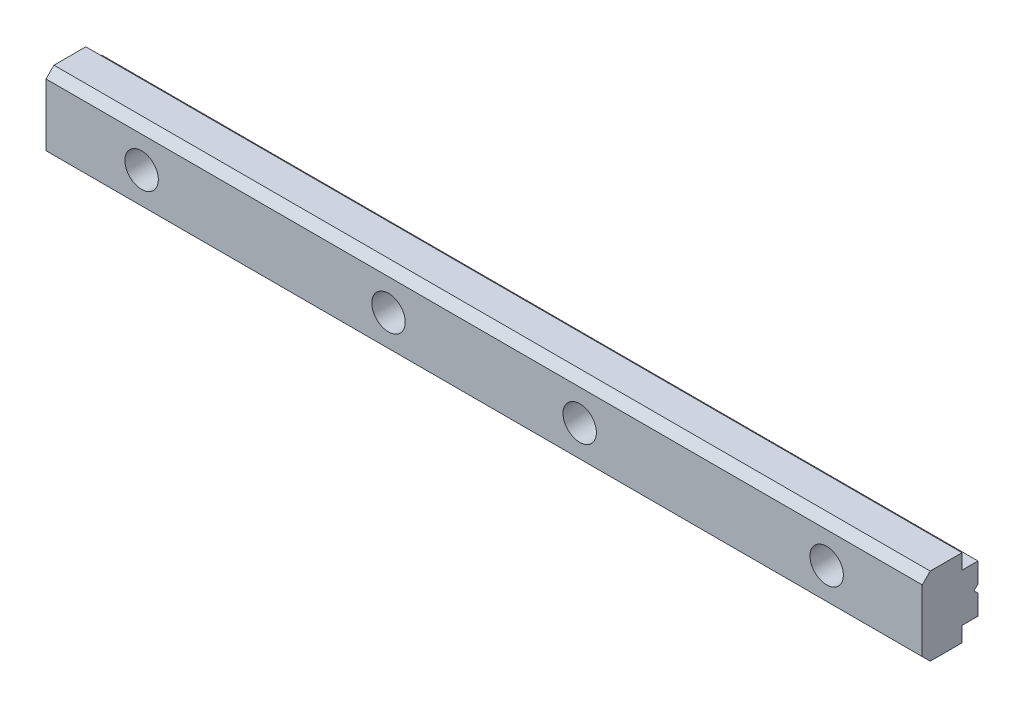
ISO-10303-21;
HEADER;
FILE_DESCRIPTION(('STEP AP214'),'2;1');
FILE_NAME('part.step','',(''),(''),'','','');
FILE_SCHEMA(('AUTOMOTIVE_DESIGN { 1 0 10303 214 1 1 1 1 }'));
ENDSEC;
DATA;
#1=APPLICATION_CONTEXT('core data for automotive mechanical design processes');
#2=APPLICATION_PROTOCOL_DEFINITION('international standard','automotive_design',2000,#1);
#3=PRODUCT_CONTEXT('',#1,'mechanical');
#4=PRODUCT('Part','Part','',(#3));
#5=PRODUCT_RELATED_PRODUCT_CATEGORY('part','',(#4));
#6=PRODUCT_DEFINITION_FORMATION('','',#4);
#7=PRODUCT_DEFINITION_CONTEXT('part definition',#1,'design');
#8=PRODUCT_DEFINITION('design','',#6,#7);
#9=PRODUCT_DEFINITION_SHAPE('','',#8);
#10=(LENGTH_UNIT() NAMED_UNIT(*) SI_UNIT(.MILLI.,.METRE.));
#11=(NAMED_UNIT(*) PLANE_ANGLE_UNIT() SI_UNIT($,.RADIAN.));
#12=(NAMED_UNIT(*) SI_UNIT($,.STERADIAN.) SOLID_ANGLE_UNIT());
#13=UNCERTAINTY_MEASURE_WITH_UNIT(LENGTH_MEASURE(1.E-05),#10,'distance_accuracy_value','');
#14=(GEOMETRIC_REPRESENTATION_CONTEXT(3) GLOBAL_UNCERTAINTY_ASSIGNED_CONTEXT((#13)) GLOBAL_UNIT_ASSIGNED_CONTEXT((#10,
#11,#12)) REPRESENTATION_CONTEXT('',''));
#15=CARTESIAN_POINT('',(0.,0.,0.));
#16=DIRECTION('',(0.,0.,1.));
#17=DIRECTION('',(1.,0.,0.));
#18=AXIS2_PLACEMENT_3D('',#15,#16,#17);
#19=CARTESIAN_POINT('',(55.,3.,0.5));
#20=DIRECTION('',(0.,-0.707106781186548,0.707106781186548));
#21=DIRECTION('',(0.,-0.707106781186548,-0.707106781186548));
#22=AXIS2_PLACEMENT_3D('',#19,#20,#21);
#23=PLANE('',#22);
#24=DIRECTION('',(-1.,0.,0.));
#25=VECTOR('',#24,1.);
#26=CARTESIAN_POINT('',(55.,2.5,0.));
#27=LINE('',#26,#25);
#28=CARTESIAN_POINT('',(55.,2.5,0.));
#29=VERTEX_POINT('',#28);
#30=CARTESIAN_POINT('',(45.0396078054371,2.5,0.));
#31=VERTEX_POINT('',#30);
#32=EDGE_CURVE('E242',#29,#31,#27,.T.);
#33=ORIENTED_EDGE('',*,*,#32,.T.);
#34=CARTESIAN_POINT('',(43.,3.,0.5));
#35=DIRECTION('',(0.,-0.707106781186548,0.707106781186548));
#36=DIRECTION('',(0.,-0.707106781186548,-0.707106781186548));
#37=AXIS2_PLACEMENT_3D('',#34,#35,#36);
#38=ELLIPSE('',#37,2.96984848098349,2.09999999999999);
#39=CARTESIAN_POINT('',(45.1,3.,0.5));
#40=VERTEX_POINT('',#39);
#41=EDGE_CURVE('E212',#31,#40,#38,.T.);
#42=ORIENTED_EDGE('',*,*,#41,.T.);
#43=DIRECTION('',(-1.,0.,0.));
#44=VECTOR('',#43,1.);
#45=CARTESIAN_POINT('',(55.,3.,0.5));
#46=LINE('',#45,#44);
#47=CARTESIAN_POINT('',(55.,3.,0.5));
#48=VERTEX_POINT('',#47);
#49=EDGE_CURVE('E237',#48,#40,#46,.T.);
#50=ORIENTED_EDGE('',*,*,#49,.F.);
#51=DIRECTION('',(0.,0.707106781186548,0.707106781186548));
#52=VECTOR('',#51,1.);
#53=CARTESIAN_POINT('',(55.,3.,0.5));
#54=LINE('',#53,#52);
#55=EDGE_CURVE('E309',#29,#48,#54,.T.);
#56=ORIENTED_EDGE('',*,*,#55,.F.);
#57=EDGE_LOOP('',(#33,#42,#50,#56));
#58=FACE_BOUND('',#57,.T.);
#59=ADVANCED_FACE('F37',(#58),#23,.F.);
#60=CARTESIAN_POINT('',(55.,0.,0.));
#61=DIRECTION('',(0.,0.,1.));
#62=DIRECTION('',(1.,0.,0.));
#63=AXIS2_PLACEMENT_3D('',#60,#61,#62);
#64=PLANE('',#63);
#65=CARTESIAN_POINT('',(43.,3.,0.));
#66=DIRECTION('',(0.,0.,-1.));
#67=DIRECTION('',(-1.,0.,0.));
#68=AXIS2_PLACEMENT_3D('',#65,#66,#67);
#69=CIRCLE('',#68,2.1);
#70=CARTESIAN_POINT('',(40.9603921945629,2.5,0.));
#71=VERTEX_POINT('',#70);
#72=EDGE_CURVE('E222',#31,#71,#69,.T.);
#73=ORIENTED_EDGE('',*,*,#72,.F.);
#74=ORIENTED_EDGE('',*,*,#32,.F.);
#75=DIRECTION('',(0.,1.,0.));
#76=VECTOR('',#75,1.);
#77=CARTESIAN_POINT('',(55.,0.,0.));
#78=LINE('',#77,#76);
#79=CARTESIAN_POINT('',(55.,0.,0.));
#80=VERTEX_POINT('',#79);
#81=EDGE_CURVE('E307',#80,#29,#78,.T.);
#82=ORIENTED_EDGE('',*,*,#81,.F.);
#83=DIRECTION('',(-1.,0.,0.));
#84=VECTOR('',#83,1.);
#85=CARTESIAN_POINT('',(55.,0.,0.));
#86=LINE('',#85,#84);
#87=CARTESIAN_POINT('',(-55.,0.,0.));
#88=VERTEX_POINT('',#87);
#89=EDGE_CURVE('E245',#80,#88,#86,.T.);
#90=ORIENTED_EDGE('',*,*,#89,.T.);
#91=DIRECTION('',(0.,1.,0.));
#92=VECTOR('',#91,1.);
#93=CARTESIAN_POINT('',(-55.,0.,0.));
#94=LINE('',#93,#92);
#95=CARTESIAN_POINT('',(-55.,2.5,0.));
#96=VERTEX_POINT('',#95);
#97=EDGE_CURVE('E335',#88,#96,#94,.T.);
#98=ORIENTED_EDGE('',*,*,#97,.T.);
#99=CARTESIAN_POINT('',(-45.0396078054371,2.5,0.));
#100=VERTEX_POINT('',#99);
#101=EDGE_CURVE('E240',#100,#96,#27,.T.);
#102=ORIENTED_EDGE('',*,*,#101,.F.);
#103=CARTESIAN_POINT('',(-43.,3.,0.));
#104=DIRECTION('',(0.,0.,-1.));
#105=DIRECTION('',(-1.,0.,0.));
#106=AXIS2_PLACEMENT_3D('',#103,#104,#105);
#107=CIRCLE('',#106,2.1);
#108=CARTESIAN_POINT('',(-40.9603921945629,2.5,0.));
#109=VERTEX_POINT('',#108);
#110=EDGE_CURVE('E289',#109,#100,#107,.T.);
#111=ORIENTED_EDGE('',*,*,#110,.F.);
#112=CARTESIAN_POINT('',(-14.0396078054371,2.5,0.));
#113=VERTEX_POINT('',#112);
#114=EDGE_CURVE('E479',#113,#109,#27,.T.);
#115=ORIENTED_EDGE('',*,*,#114,.F.);
#116=CARTESIAN_POINT('',(-12.,3.,0.));
#117=DIRECTION('',(0.,0.,-1.));
#118=DIRECTION('',(-1.,0.,0.));
#119=AXIS2_PLACEMENT_3D('',#116,#117,#118);
#120=CIRCLE('',#119,2.1);
#121=CARTESIAN_POINT('',(-9.96039219456289,2.5,0.));
#122=VERTEX_POINT('',#121);
#123=EDGE_CURVE('E279',#122,#113,#120,.T.);
#124=ORIENTED_EDGE('',*,*,#123,.F.);
#125=CARTESIAN_POINT('',(9.96039219456289,2.5,0.));
#126=VERTEX_POINT('',#125);
#127=EDGE_CURVE('E480',#126,#122,#27,.T.);
#128=ORIENTED_EDGE('',*,*,#127,.F.);
#129=CARTESIAN_POINT('',(12.,3.,0.));
#130=DIRECTION('',(0.,0.,-1.));
#131=DIRECTION('',(-1.,0.,0.));
#132=AXIS2_PLACEMENT_3D('',#129,#130,#131);
#133=CIRCLE('',#132,2.1);
#134=CARTESIAN_POINT('',(14.0396078054371,2.5,0.));
#135=VERTEX_POINT('',#134);
#136=EDGE_CURVE('E270',#135,#126,#133,.T.);
#137=ORIENTED_EDGE('',*,*,#136,.F.);
#138=EDGE_CURVE('E246',#71,#135,#27,.T.);
#139=ORIENTED_EDGE('',*,*,#138,.F.);
#140=EDGE_LOOP('',(#73,#74,#82,#90,#98,#102,#111,#115,#124,#128,#137,#139));
#141=FACE_BOUND('',#140,.T.);
#142=ADVANCED_FACE('F432',(#141),#64,.F.);
#143=CARTESIAN_POINT('',(55.,3.,0.5));
#144=DIRECTION('',(0.,0.707106781186548,0.707106781186548));
#145=DIRECTION('',(0.,-0.707106781186548,0.707106781186548));
#146=AXIS2_PLACEMENT_3D('',#143,#144,#145);
#147=PLANE('',#146);
#148=DIRECTION('',(-1.,0.,0.));
#149=VECTOR('',#148,1.);
#150=CARTESIAN_POINT('',(55.,3.5,0.));
#151=LINE('',#150,#149);
#152=CARTESIAN_POINT('',(40.9603921945629,3.5,0.));
#153=VERTEX_POINT('',#152);
#154=CARTESIAN_POINT('',(14.0396078054371,3.5,0.));
#155=VERTEX_POINT('',#154);
#156=EDGE_CURVE('E218',#153,#155,#151,.T.);
#157=ORIENTED_EDGE('',*,*,#156,.F.);
#158=CARTESIAN_POINT('',(43.,3.,0.5));
#159=DIRECTION('',(0.,0.707106781186548,0.707106781186548));
#160=DIRECTION('',(0.,0.707106781186548,-0.707106781186548));
#161=AXIS2_PLACEMENT_3D('',#158,#159,#160);
#162=ELLIPSE('',#161,2.96984848098349,2.09999999999999);
#163=CARTESIAN_POINT('',(40.9,3.,0.5));
#164=VERTEX_POINT('',#163);
#165=EDGE_CURVE('E205',#153,#164,#162,.T.);
#166=ORIENTED_EDGE('',*,*,#165,.T.);
#167=CARTESIAN_POINT('',(14.1,3.,0.5));
#168=VERTEX_POINT('',#167);
#169=EDGE_CURVE('E241',#164,#168,#46,.T.);
#170=ORIENTED_EDGE('',*,*,#169,.T.);
#171=CARTESIAN_POINT('',(12.,3.,0.5));
#172=DIRECTION('',(0.,0.707106781186548,0.707106781186548));
#173=DIRECTION('',(0.,0.707106781186548,-0.707106781186548));
#174=AXIS2_PLACEMENT_3D('',#171,#172,#173);
#175=ELLIPSE('',#174,2.96984848098349,2.09999999999999);
#176=EDGE_CURVE('E227',#168,#155,#175,.T.);
#177=ORIENTED_EDGE('',*,*,#176,.T.);
#178=EDGE_LOOP('',(#157,#166,#170,#177));
#179=FACE_BOUND('',#178,.T.);
#180=ADVANCED_FACE('F225',(#179),#147,.F.);
#181=ORIENTED_EDGE('',*,*,#169,.F.);
#182=EDGE_CURVE('E208',#164,#71,#38,.T.);
#183=ORIENTED_EDGE('',*,*,#182,.T.);
#184=ORIENTED_EDGE('',*,*,#138,.T.);
#185=CARTESIAN_POINT('',(12.,3.,0.5));
#186=DIRECTION('',(0.,-0.707106781186548,0.707106781186548));
#187=DIRECTION('',(0.,-0.707106781186548,-0.707106781186548));
#188=AXIS2_PLACEMENT_3D('',#185,#186,#187);
#189=ELLIPSE('',#188,2.96984848098349,2.09999999999999);
#190=EDGE_CURVE('E268',#135,#168,#189,.T.);
#191=ORIENTED_EDGE('',*,*,#190,.T.);
#192=EDGE_LOOP('',(#181,#183,#184,#191));
#193=FACE_BOUND('',#192,.T.);
#194=ADVANCED_FACE('F435',(#193),#23,.F.);
#195=CARTESIAN_POINT('',(9.96039219456289,3.5,0.));
#196=VERTEX_POINT('',#195);
#197=CARTESIAN_POINT('',(-9.96039219456289,3.5,0.));
#198=VERTEX_POINT('',#197);
#199=EDGE_CURVE('E228',#196,#198,#151,.T.);
#200=ORIENTED_EDGE('',*,*,#199,.F.);
#201=CARTESIAN_POINT('',(9.90000000000001,3.,0.5));
#202=VERTEX_POINT('',#201);
#203=EDGE_CURVE('E62',#196,#202,#175,.T.);
#204=ORIENTED_EDGE('',*,*,#203,.T.);
#205=CARTESIAN_POINT('',(-9.9,3.,0.5));
#206=VERTEX_POINT('',#205);
#207=EDGE_CURVE('E392',#202,#206,#46,.T.);
#208=ORIENTED_EDGE('',*,*,#207,.T.);
#209=CARTESIAN_POINT('',(-12.,3.,0.499999999999997));
#210=DIRECTION('',(0.,0.707106781186548,0.707106781186548));
#211=DIRECTION('',(0.,0.707106781186548,-0.707106781186548));
#212=AXIS2_PLACEMENT_3D('',#209,#210,#211);
#213=ELLIPSE('',#212,2.96984848098349,2.09999999999999);
#214=EDGE_CURVE('E261',#206,#198,#213,.T.);
#215=ORIENTED_EDGE('',*,*,#214,.T.);
#216=EDGE_LOOP('',(#200,#204,#208,#215));
#217=FACE_BOUND('',#216,.T.);
#218=ADVANCED_FACE('F443',(#217),#147,.F.);
#219=CARTESIAN_POINT('',(55.,3.5,0.));
#220=DIRECTION('',(0.,0.,1.));
#221=DIRECTION('',(1.,0.,0.));
#222=AXIS2_PLACEMENT_3D('',#219,#220,#221);
#223=PLANE('',#222);
#224=CARTESIAN_POINT('',(55.,3.5,0.));
#225=VERTEX_POINT('',#224);
#226=CARTESIAN_POINT('',(45.0396078054371,3.5,0.));
#227=VERTEX_POINT('',#226);
#228=EDGE_CURVE('E221',#225,#227,#151,.T.);
#229=ORIENTED_EDGE('',*,*,#228,.T.);
#230=EDGE_CURVE('E54',#153,#227,#69,.T.);
#231=ORIENTED_EDGE('',*,*,#230,.F.);
#232=ORIENTED_EDGE('',*,*,#156,.T.);
#233=EDGE_CURVE('E265',#196,#155,#133,.T.);
#234=ORIENTED_EDGE('',*,*,#233,.F.);
#235=ORIENTED_EDGE('',*,*,#199,.T.);
#236=CARTESIAN_POINT('',(-14.0396078054371,3.5,0.));
#237=VERTEX_POINT('',#236);
#238=EDGE_CURVE('E262',#237,#198,#120,.T.);
#239=ORIENTED_EDGE('',*,*,#238,.F.);
#240=CARTESIAN_POINT('',(-40.9603921945629,3.5,0.));
#241=VERTEX_POINT('',#240);
#242=EDGE_CURVE('E232',#237,#241,#151,.T.);
#243=ORIENTED_EDGE('',*,*,#242,.T.);
#244=CARTESIAN_POINT('',(-45.0396078054371,3.5,0.));
#245=VERTEX_POINT('',#244);
#246=EDGE_CURVE('E258',#245,#241,#107,.T.);
#247=ORIENTED_EDGE('',*,*,#246,.F.);
#248=CARTESIAN_POINT('',(-55.,3.5,0.));
#249=VERTEX_POINT('',#248);
#250=EDGE_CURVE('E231',#245,#249,#151,.T.);
#251=ORIENTED_EDGE('',*,*,#250,.T.);
#252=DIRECTION('',(0.,1.,0.));
#253=VECTOR('',#252,1.);
#254=CARTESIAN_POINT('',(-55.,3.5,0.));
#255=LINE('',#254,#253);
#256=CARTESIAN_POINT('',(-55.,6.,0.));
#257=VERTEX_POINT('',#256);
#258=EDGE_CURVE('E344',#249,#257,#255,.T.);
#259=ORIENTED_EDGE('',*,*,#258,.T.);
#260=DIRECTION('',(-1.,0.,0.));
#261=VECTOR('',#260,1.);
#262=CARTESIAN_POINT('',(55.,6.,0.));
#263=LINE('',#262,#261);
#264=CARTESIAN_POINT('',(55.,6.,0.));
#265=VERTEX_POINT('',#264);
#266=EDGE_CURVE('E235',#265,#257,#263,.T.);
#267=ORIENTED_EDGE('',*,*,#266,.F.);
#268=DIRECTION('',(0.,1.,0.));
#269=VECTOR('',#268,1.);
#270=CARTESIAN_POINT('',(55.,3.5,0.));
#271=LINE('',#270,#269);
#272=EDGE_CURVE('E313',#225,#265,#271,.T.);
#273=ORIENTED_EDGE('',*,*,#272,.F.);
#274=EDGE_LOOP('',(#229,#231,#232,#234,#235,#239,#243,#247,#251,#259,#267,#273));
#275=FACE_BOUND('',#274,.T.);
#276=ADVANCED_FACE('F217',(#275),#223,.F.);
#277=ORIENTED_EDGE('',*,*,#207,.F.);
#278=EDGE_CURVE('E276',#202,#126,#189,.T.);
#279=ORIENTED_EDGE('',*,*,#278,.T.);
#280=ORIENTED_EDGE('',*,*,#127,.T.);
#281=CARTESIAN_POINT('',(-12.,3.,0.500000000000003));
#282=DIRECTION('',(0.,-0.707106781186548,0.707106781186548));
#283=DIRECTION('',(0.,-0.707106781186548,-0.707106781186548));
#284=AXIS2_PLACEMENT_3D('',#281,#282,#283);
#285=ELLIPSE('',#284,2.96984848098349,2.09999999999999);
#286=EDGE_CURVE('E282',#122,#206,#285,.T.);
#287=ORIENTED_EDGE('',*,*,#286,.T.);
#288=EDGE_LOOP('',(#277,#279,#280,#287));
#289=FACE_BOUND('',#288,.T.);
#290=ADVANCED_FACE('F445',(#289),#23,.F.);
#291=ORIENTED_EDGE('',*,*,#242,.F.);
#292=CARTESIAN_POINT('',(-14.1,3.,0.5));
#293=VERTEX_POINT('',#292);
#294=EDGE_CURVE('E283',#237,#293,#213,.T.);
#295=ORIENTED_EDGE('',*,*,#294,.T.);
#296=CARTESIAN_POINT('',(-40.9,3.,0.5));
#297=VERTEX_POINT('',#296);
#298=EDGE_CURVE('E389',#293,#297,#46,.T.);
#299=ORIENTED_EDGE('',*,*,#298,.T.);
#300=CARTESIAN_POINT('',(-43.,3.,0.499999999999997));
#301=DIRECTION('',(0.,0.707106781186548,0.707106781186548));
#302=DIRECTION('',(0.,0.707106781186548,-0.707106781186548));
#303=AXIS2_PLACEMENT_3D('',#300,#301,#302);
#304=ELLIPSE('',#303,2.96984848098349,2.09999999999999);
#305=EDGE_CURVE('E257',#297,#241,#304,.T.);
#306=ORIENTED_EDGE('',*,*,#305,.T.);
#307=EDGE_LOOP('',(#291,#295,#299,#306));
#308=FACE_BOUND('',#307,.T.);
#309=ADVANCED_FACE('F387',(#308),#147,.F.);
#310=ORIENTED_EDGE('',*,*,#298,.F.);
#311=EDGE_CURVE('E286',#293,#113,#285,.T.);
#312=ORIENTED_EDGE('',*,*,#311,.T.);
#313=ORIENTED_EDGE('',*,*,#114,.T.);
#314=CARTESIAN_POINT('',(-43.,3.,0.500000000000003));
#315=DIRECTION('',(0.,-0.707106781186548,0.707106781186548));
#316=DIRECTION('',(0.,-0.707106781186548,-0.707106781186548));
#317=AXIS2_PLACEMENT_3D('',#314,#315,#316);
#318=ELLIPSE('',#317,2.96984848098349,2.09999999999999);
#319=EDGE_CURVE('E292',#109,#297,#318,.T.);
#320=ORIENTED_EDGE('',*,*,#319,.T.);
#321=EDGE_LOOP('',(#310,#312,#313,#320));
#322=FACE_BOUND('',#321,.T.);
#323=ADVANCED_FACE('F448',(#322),#23,.F.);
#324=ORIENTED_EDGE('',*,*,#250,.F.);
#325=CARTESIAN_POINT('',(-45.1,3.,0.5));
#326=VERTEX_POINT('',#325);
#327=EDGE_CURVE('E293',#245,#326,#304,.T.);
#328=ORIENTED_EDGE('',*,*,#327,.T.);
#329=CARTESIAN_POINT('',(-55.,3.,0.5));
#330=VERTEX_POINT('',#329);
#331=EDGE_CURVE('E230',#326,#330,#46,.T.);
#332=ORIENTED_EDGE('',*,*,#331,.T.);
#333=DIRECTION('',(0.,0.707106781186548,-0.707106781186548));
#334=VECTOR('',#333,1.);
#335=CARTESIAN_POINT('',(-55.,3.,0.5));
#336=LINE('',#335,#334);
#337=EDGE_CURVE('E341',#330,#249,#336,.T.);
#338=ORIENTED_EDGE('',*,*,#337,.T.);
#339=EDGE_LOOP('',(#324,#328,#332,#338));
#340=FACE_BOUND('',#339,.T.);
#341=ADVANCED_FACE('F395',(#340),#147,.F.);
#342=CARTESIAN_POINT('',(55.,-1.90000000000009,6.));
#343=DIRECTION('',(0.,0.707106781186628,-0.707106781186467));
#344=DIRECTION('',(0.,0.707106781186467,0.707106781186628));
#345=AXIS2_PLACEMENT_3D('',#342,#343,#344);
#346=PLANE('',#345);
#347=DIRECTION('',(0.,-0.707106781186467,-0.707106781186628));
#348=VECTOR('',#347,1.);
#349=CARTESIAN_POINT('',(-55.,-1.90000000000009,6.));
#350=LINE('',#349,#348);
#351=CARTESIAN_POINT('',(-55.,-0.900000000000318,7.));
#352=VERTEX_POINT('',#351);
#353=CARTESIAN_POINT('',(-55.,-1.90000000000009,6.));
#354=VERTEX_POINT('',#353);
#355=EDGE_CURVE('E326',#352,#354,#350,.T.);
#356=ORIENTED_EDGE('',*,*,#355,.T.);
#357=DIRECTION('',(-1.,0.,0.));
#358=VECTOR('',#357,1.);
#359=CARTESIAN_POINT('',(55.,-1.90000000000009,6.));
#360=LINE('',#359,#358);
#361=CARTESIAN_POINT('',(55.,-1.90000000000009,6.));
#362=VERTEX_POINT('',#361);
#363=EDGE_CURVE('E11',#362,#354,#360,.T.);
#364=ORIENTED_EDGE('',*,*,#363,.F.);
#365=DIRECTION('',(0.,-0.707106781186467,-0.707106781186628));
#366=VECTOR('',#365,1.);
#367=CARTESIAN_POINT('',(55.,-1.90000000000009,6.));
#368=LINE('',#367,#366);
#369=CARTESIAN_POINT('',(55.,-0.900000000000318,7.));
#370=VERTEX_POINT('',#369);
#371=EDGE_CURVE('E297',#370,#362,#368,.T.);
#372=ORIENTED_EDGE('',*,*,#371,.F.);
#373=DIRECTION('',(-1.,0.,0.));
#374=VECTOR('',#373,1.);
#375=CARTESIAN_POINT('',(55.,-0.900000000000318,7.));
#376=LINE('',#375,#374);
#377=EDGE_CURVE('E325',#370,#352,#376,.T.);
#378=ORIENTED_EDGE('',*,*,#377,.T.);
#379=EDGE_LOOP('',(#356,#364,#372,#378));
#380=FACE_BOUND('',#379,.T.);
#381=ADVANCED_FACE('F39',(#380),#346,.F.);
#382=CARTESIAN_POINT('',(55.,-1.90000000000009,2.));
#383=DIRECTION('',(0.,1.,0.));
#384=DIRECTION('',(0.,0.,1.));
#385=AXIS2_PLACEMENT_3D('',#382,#383,#384);
#386=PLANE('',#385);
#387=DIRECTION('',(0.,0.,-1.));
#388=VECTOR('',#387,1.);
#389=CARTESIAN_POINT('',(-55.,-1.90000000000009,2.));
#390=LINE('',#389,#388);
#391=CARTESIAN_POINT('',(-55.,-1.90000000000009,2.));
#392=VERTEX_POINT('',#391);
#393=EDGE_CURVE('E329',#354,#392,#390,.T.);
#394=ORIENTED_EDGE('',*,*,#393,.T.);
#395=DIRECTION('',(-1.,0.,0.));
#396=VECTOR('',#395,1.);
#397=CARTESIAN_POINT('',(55.,-1.90000000000009,2.));
#398=LINE('',#397,#396);
#399=CARTESIAN_POINT('',(55.,-1.90000000000009,2.));
#400=VERTEX_POINT('',#399);
#401=EDGE_CURVE('E46',#400,#392,#398,.T.);
#402=ORIENTED_EDGE('',*,*,#401,.F.);
#403=DIRECTION('',(0.,0.,-1.));
#404=VECTOR('',#403,1.);
#405=CARTESIAN_POINT('',(55.,-1.90000000000009,2.));
#406=LINE('',#405,#404);
#407=EDGE_CURVE('E300',#362,#400,#406,.T.);
#408=ORIENTED_EDGE('',*,*,#407,.F.);
#409=ORIENTED_EDGE('',*,*,#363,.T.);
#410=EDGE_LOOP('',(#394,#402,#408,#409));
#411=FACE_BOUND('',#410,.T.);
#412=ADVANCED_FACE('F495',(#411),#386,.F.);
#413=CARTESIAN_POINT('',(55.,0.,2.));
#414=DIRECTION('',(0.,0.,1.));
#415=DIRECTION('',(1.,0.,0.));
#416=AXIS2_PLACEMENT_3D('',#413,#414,#415);
#417=PLANE('',#416);
#418=DIRECTION('',(0.,1.,0.));
#419=VECTOR('',#418,1.);
#420=CARTESIAN_POINT('',(-55.,0.,2.));
#421=LINE('',#420,#419);
#422=CARTESIAN_POINT('',(-55.,0.,2.));
#423=VERTEX_POINT('',#422);
#424=EDGE_CURVE('E331',#392,#423,#421,.T.);
#425=ORIENTED_EDGE('',*,*,#424,.T.);
#426=DIRECTION('',(-1.,0.,0.));
#427=VECTOR('',#426,1.);
#428=CARTESIAN_POINT('',(55.,0.,2.));
#429=LINE('',#428,#427);
#430=CARTESIAN_POINT('',(55.,0.,2.));
#431=VERTEX_POINT('',#430);
#432=EDGE_CURVE('E249',#431,#423,#429,.T.);
#433=ORIENTED_EDGE('',*,*,#432,.F.);
#434=DIRECTION('',(0.,1.,0.));
#435=VECTOR('',#434,1.);
#436=CARTESIAN_POINT('',(55.,0.,2.));
#437=LINE('',#436,#435);
#438=EDGE_CURVE('E303',#400,#431,#437,.T.);
#439=ORIENTED_EDGE('',*,*,#438,.F.);
#440=ORIENTED_EDGE('',*,*,#401,.T.);
#441=EDGE_LOOP('',(#425,#433,#439,#440));
#442=FACE_BOUND('',#441,.T.);
#443=ADVANCED_FACE('F453',(#442),#417,.F.);
#444=CARTESIAN_POINT('',(55.,0.,0.));
#445=DIRECTION('',(0.,1.,0.));
#446=DIRECTION('',(0.,0.,1.));
#447=AXIS2_PLACEMENT_3D('',#444,#445,#446);
#448=PLANE('',#447);
#449=DIRECTION('',(0.,0.,-1.));
#450=VECTOR('',#449,1.);
#451=CARTESIAN_POINT('',(-55.,0.,0.));
#452=LINE('',#451,#450);
#453=EDGE_CURVE('E333',#423,#88,#452,.T.);
#454=ORIENTED_EDGE('',*,*,#453,.T.);
#455=ORIENTED_EDGE('',*,*,#89,.F.);
#456=DIRECTION('',(0.,0.,-1.));
#457=VECTOR('',#456,1.);
#458=CARTESIAN_POINT('',(55.,0.,0.));
#459=LINE('',#458,#457);
#460=EDGE_CURVE('E305',#431,#80,#459,.T.);
#461=ORIENTED_EDGE('',*,*,#460,.F.);
#462=ORIENTED_EDGE('',*,*,#432,.T.);
#463=EDGE_LOOP('',(#454,#455,#461,#462));
#464=FACE_BOUND('',#463,.T.);
#465=ADVANCED_FACE('F447',(#464),#448,.F.);
#466=ORIENTED_EDGE('',*,*,#331,.F.);
#467=EDGE_CURVE('E296',#326,#100,#318,.T.);
#468=ORIENTED_EDGE('',*,*,#467,.T.);
#469=ORIENTED_EDGE('',*,*,#101,.T.);
#470=DIRECTION('',(0.,0.707106781186548,0.707106781186548));
#471=VECTOR('',#470,1.);
#472=CARTESIAN_POINT('',(-55.,3.,0.5));
#473=LINE('',#472,#471);
#474=EDGE_CURVE('E338',#96,#330,#473,.T.);
#475=ORIENTED_EDGE('',*,*,#474,.T.);
#476=EDGE_LOOP('',(#466,#468,#469,#475));
#477=FACE_BOUND('',#476,.T.);
#478=ADVANCED_FACE('F401',(#477),#23,.F.);
#479=ORIENTED_EDGE('',*,*,#49,.T.);
#480=EDGE_CURVE('E214',#40,#227,#162,.T.);
#481=ORIENTED_EDGE('',*,*,#480,.T.);
#482=ORIENTED_EDGE('',*,*,#228,.F.);
#483=DIRECTION('',(0.,0.707106781186548,-0.707106781186548));
#484=VECTOR('',#483,1.);
#485=CARTESIAN_POINT('',(55.,3.,0.5));
#486=LINE('',#485,#484);
#487=EDGE_CURVE('E311',#48,#225,#486,.T.);
#488=ORIENTED_EDGE('',*,*,#487,.F.);
#489=EDGE_LOOP('',(#479,#481,#482,#488));
#490=FACE_BOUND('',#489,.T.);
#491=ADVANCED_FACE('F415',(#490),#147,.F.);
#492=CARTESIAN_POINT('',(55.,6.,0.));
#493=DIRECTION('',(0.,-1.,0.));
#494=DIRECTION('',(0.,0.,-1.));
#495=AXIS2_PLACEMENT_3D('',#492,#493,#494);
#496=PLANE('',#495);
#497=DIRECTION('',(0.,0.,1.));
#498=VECTOR('',#497,1.);
#499=CARTESIAN_POINT('',(-55.,6.,0.));
#500=LINE('',#499,#498);
#501=CARTESIAN_POINT('',(-55.,6.,2.));
#502=VERTEX_POINT('',#501);
#503=EDGE_CURVE('E346',#257,#502,#500,.T.);
#504=ORIENTED_EDGE('',*,*,#503,.T.);
#505=DIRECTION('',(-1.,0.,0.));
#506=VECTOR('',#505,1.);
#507=CARTESIAN_POINT('',(55.,6.,2.));
#508=LINE('',#507,#506);
#509=CARTESIAN_POINT('',(55.,6.,2.));
#510=VERTEX_POINT('',#509);
#511=EDGE_CURVE('E365',#510,#502,#508,.T.);
#512=ORIENTED_EDGE('',*,*,#511,.F.);
#513=DIRECTION('',(0.,0.,1.));
#514=VECTOR('',#513,1.);
#515=CARTESIAN_POINT('',(55.,6.,0.));
#516=LINE('',#515,#514);
#517=EDGE_CURVE('E315',#265,#510,#516,.T.);
#518=ORIENTED_EDGE('',*,*,#517,.F.);
#519=ORIENTED_EDGE('',*,*,#266,.T.);
#520=EDGE_LOOP('',(#504,#512,#518,#519));
#521=FACE_BOUND('',#520,.T.);
#522=ADVANCED_FACE('F407',(#521),#496,.F.);
#523=CARTESIAN_POINT('',(55.,7.90000000000009,2.));
#524=DIRECTION('',(0.,0.,1.));
#525=DIRECTION('',(1.,0.,0.));
#526=AXIS2_PLACEMENT_3D('',#523,#524,#525);
#527=PLANE('',#526);
#528=DIRECTION('',(0.,1.,0.));
#529=VECTOR('',#528,1.);
#530=CARTESIAN_POINT('',(-55.,7.90000000000009,2.));
#531=LINE('',#530,#529);
#532=CARTESIAN_POINT('',(-55.,7.90000000000009,2.));
#533=VERTEX_POINT('',#532);
#534=EDGE_CURVE('E348',#502,#533,#531,.T.);
#535=ORIENTED_EDGE('',*,*,#534,.T.);
#536=DIRECTION('',(-1.,0.,0.));
#537=VECTOR('',#536,1.);
#538=CARTESIAN_POINT('',(55.,7.90000000000009,2.));
#539=LINE('',#538,#537);
#540=CARTESIAN_POINT('',(55.,7.90000000000009,2.));
#541=VERTEX_POINT('',#540);
#542=EDGE_CURVE('E363',#541,#533,#539,.T.);
#543=ORIENTED_EDGE('',*,*,#542,.F.);
#544=DIRECTION('',(0.,1.,0.));
#545=VECTOR('',#544,1.);
#546=CARTESIAN_POINT('',(55.,7.90000000000009,2.));
#547=LINE('',#546,#545);
#548=EDGE_CURVE('E317',#510,#541,#547,.T.);
#549=ORIENTED_EDGE('',*,*,#548,.F.);
#550=ORIENTED_EDGE('',*,*,#511,.T.);
#551=EDGE_LOOP('',(#535,#543,#549,#550));
#552=FACE_BOUND('',#551,.T.);
#553=ADVANCED_FACE('F513',(#552),#527,.F.);
#554=CARTESIAN_POINT('',(55.,7.90000000000009,2.));
#555=DIRECTION('',(0.,-1.,0.));
#556=DIRECTION('',(0.,0.,-1.));
#557=AXIS2_PLACEMENT_3D('',#554,#555,#556);
#558=PLANE('',#557);
#559=DIRECTION('',(0.,0.,1.));
#560=VECTOR('',#559,1.);
#561=CARTESIAN_POINT('',(-55.,7.90000000000009,2.));
#562=LINE('',#561,#560);
#563=CARTESIAN_POINT('',(-55.,7.90000000000009,6.));
#564=VERTEX_POINT('',#563);
#565=EDGE_CURVE('E350',#533,#564,#562,.T.);
#566=ORIENTED_EDGE('',*,*,#565,.T.);
#567=DIRECTION('',(-1.,0.,0.));
#568=VECTOR('',#567,1.);
#569=CARTESIAN_POINT('',(55.,7.90000000000009,6.));
#570=LINE('',#569,#568);
#571=CARTESIAN_POINT('',(55.,7.90000000000009,6.));
#572=VERTEX_POINT('',#571);
#573=EDGE_CURVE('E360',#572,#564,#570,.T.);
#574=ORIENTED_EDGE('',*,*,#573,.F.);
#575=DIRECTION('',(0.,0.,1.));
#576=VECTOR('',#575,1.);
#577=CARTESIAN_POINT('',(55.,7.90000000000009,2.));
#578=LINE('',#577,#576);
#579=EDGE_CURVE('E319',#541,#572,#578,.T.);
#580=ORIENTED_EDGE('',*,*,#579,.F.);
#581=ORIENTED_EDGE('',*,*,#542,.T.);
#582=EDGE_LOOP('',(#566,#574,#580,#581));
#583=FACE_BOUND('',#582,.T.);
#584=ADVANCED_FACE('F512',(#583),#558,.F.);
#585=CARTESIAN_POINT('',(55.,7.90000000000009,6.));
#586=DIRECTION('',(0.,-0.707106781186467,-0.707106781186628));
#587=DIRECTION('',(0.,0.707106781186628,-0.707106781186467));
#588=AXIS2_PLACEMENT_3D('',#585,#586,#587);
#589=PLANE('',#588);
#590=DIRECTION('',(0.,-0.707106781186628,0.707106781186467));
#591=VECTOR('',#590,1.);
#592=CARTESIAN_POINT('',(-55.,7.90000000000009,6.));
#593=LINE('',#592,#591);
#594=CARTESIAN_POINT('',(-55.,6.89999999999986,7.));
#595=VERTEX_POINT('',#594);
#596=EDGE_CURVE('E352',#564,#595,#593,.T.);
#597=ORIENTED_EDGE('',*,*,#596,.T.);
#598=DIRECTION('',(-1.,0.,0.));
#599=VECTOR('',#598,1.);
#600=CARTESIAN_POINT('',(55.,6.89999999999986,7.));
#601=LINE('',#600,#599);
#602=CARTESIAN_POINT('',(55.,6.89999999999986,7.));
#603=VERTEX_POINT('',#602);
#604=EDGE_CURVE('E357',#603,#595,#601,.T.);
#605=ORIENTED_EDGE('',*,*,#604,.F.);
#606=DIRECTION('',(0.,-0.707106781186628,0.707106781186467));
#607=VECTOR('',#606,1.);
#608=CARTESIAN_POINT('',(55.,7.90000000000009,6.));
#609=LINE('',#608,#607);
#610=EDGE_CURVE('E321',#572,#603,#609,.T.);
#611=ORIENTED_EDGE('',*,*,#610,.F.);
#612=ORIENTED_EDGE('',*,*,#573,.T.);
#613=EDGE_LOOP('',(#597,#605,#611,#612));
#614=FACE_BOUND('',#613,.T.);
#615=ADVANCED_FACE('F508',(#614),#589,.F.);
#616=CARTESIAN_POINT('',(55.,-0.900000000000318,7.));
#617=DIRECTION('',(0.,0.,-1.));
#618=DIRECTION('',(-1.,0.,0.));
#619=AXIS2_PLACEMENT_3D('',#616,#617,#618);
#620=PLANE('',#619);
#621=CARTESIAN_POINT('',(43.,3.,7.));
#622=DIRECTION('',(0.,0.,-1.));
#623=DIRECTION('',(-1.,0.,0.));
#624=AXIS2_PLACEMENT_3D('',#621,#622,#623);
#625=CIRCLE('',#624,2.09999999999999);
#626=CARTESIAN_POINT('',(40.9,3.,7.));
#627=VERTEX_POINT('',#626);
#628=EDGE_CURVE('E41',#627,#627,#625,.T.);
#629=ORIENTED_EDGE('',*,*,#628,.T.);
#630=EDGE_LOOP('',(#629));
#631=FACE_BOUND('',#630,.T.);
#632=CARTESIAN_POINT('',(12.,3.,7.));
#633=DIRECTION('',(0.,0.,-1.));
#634=DIRECTION('',(-1.,0.,0.));
#635=AXIS2_PLACEMENT_3D('',#632,#633,#634);
#636=CIRCLE('',#635,2.09999999999999);
#637=CARTESIAN_POINT('',(9.9,3.,7.));
#638=VERTEX_POINT('',#637);
#639=EDGE_CURVE('E263',#638,#638,#636,.T.);
#640=ORIENTED_EDGE('',*,*,#639,.T.);
#641=EDGE_LOOP('',(#640));
#642=FACE_BOUND('',#641,.T.);
#643=CARTESIAN_POINT('',(-12.,3.,7.));
#644=DIRECTION('',(0.,0.,-1.));
#645=DIRECTION('',(-1.,0.,0.));
#646=AXIS2_PLACEMENT_3D('',#643,#644,#645);
#647=CIRCLE('',#646,2.09999999999999);
#648=CARTESIAN_POINT('',(-14.1,3.,7.));
#649=VERTEX_POINT('',#648);
#650=EDGE_CURVE('E259',#649,#649,#647,.T.);
#651=ORIENTED_EDGE('',*,*,#650,.T.);
#652=EDGE_LOOP('',(#651));
#653=FACE_BOUND('',#652,.T.);
#654=CARTESIAN_POINT('',(-43.,3.,7.));
#655=DIRECTION('',(0.,0.,-1.));
#656=DIRECTION('',(-1.,0.,0.));
#657=AXIS2_PLACEMENT_3D('',#654,#655,#656);
#658=CIRCLE('',#657,2.09999999999999);
#659=CARTESIAN_POINT('',(-45.1,3.,7.));
#660=VERTEX_POINT('',#659);
#661=EDGE_CURVE('E254',#660,#660,#658,.T.);
#662=ORIENTED_EDGE('',*,*,#661,.T.);
#663=EDGE_LOOP('',(#662));
#664=FACE_BOUND('',#663,.T.);
#665=DIRECTION('',(0.,-1.,0.));
#666=VECTOR('',#665,1.);
#667=CARTESIAN_POINT('',(-55.,-0.900000000000318,7.));
#668=LINE('',#667,#666);
#669=EDGE_CURVE('E301',#595,#352,#668,.T.);
#670=ORIENTED_EDGE('',*,*,#669,.T.);
#671=ORIENTED_EDGE('',*,*,#377,.F.);
#672=DIRECTION('',(0.,-1.,0.));
#673=VECTOR('',#672,1.);
#674=CARTESIAN_POINT('',(55.,-0.900000000000318,7.));
#675=LINE('',#674,#673);
#676=EDGE_CURVE('E323',#603,#370,#675,.T.);
#677=ORIENTED_EDGE('',*,*,#676,.F.);
#678=ORIENTED_EDGE('',*,*,#604,.T.);
#679=EDGE_LOOP('',(#670,#671,#677,#678));
#680=FACE_BOUND('',#679,.T.);
#681=ADVANCED_FACE('F420',(#631,#642,#653,#664,#680),#620,.F.);
#682=CARTESIAN_POINT('',(55.,0.,0.));
#683=DIRECTION('',(1.,0.,0.));
#684=DIRECTION('',(0.,0.,-1.));
#685=AXIS2_PLACEMENT_3D('',#682,#683,#684);
#686=PLANE('',#685);
#687=ORIENTED_EDGE('',*,*,#371,.T.);
#688=ORIENTED_EDGE('',*,*,#407,.T.);
#689=ORIENTED_EDGE('',*,*,#438,.T.);
#690=ORIENTED_EDGE('',*,*,#460,.T.);
#691=ORIENTED_EDGE('',*,*,#81,.T.);
#692=ORIENTED_EDGE('',*,*,#55,.T.);
#693=ORIENTED_EDGE('',*,*,#487,.T.);
#694=ORIENTED_EDGE('',*,*,#272,.T.);
#695=ORIENTED_EDGE('',*,*,#517,.T.);
#696=ORIENTED_EDGE('',*,*,#548,.T.);
#697=ORIENTED_EDGE('',*,*,#579,.T.);
#698=ORIENTED_EDGE('',*,*,#610,.T.);
#699=ORIENTED_EDGE('',*,*,#676,.T.);
#700=EDGE_LOOP('',(#687,#688,#689,#690,#691,#692,#693,#694,#695,#696,#697,#698,#699));
#701=FACE_BOUND('',#700,.T.);
#702=ADVANCED_FACE('F409',(#701),#686,.T.);
#703=CARTESIAN_POINT('',(-55.,0.,0.));
#704=DIRECTION('',(1.,0.,0.));
#705=DIRECTION('',(0.,0.,-1.));
#706=AXIS2_PLACEMENT_3D('',#703,#704,#705);
#707=PLANE('',#706);
#708=ORIENTED_EDGE('',*,*,#355,.F.);
#709=ORIENTED_EDGE('',*,*,#669,.F.);
#710=ORIENTED_EDGE('',*,*,#596,.F.);
#711=ORIENTED_EDGE('',*,*,#565,.F.);
#712=ORIENTED_EDGE('',*,*,#534,.F.);
#713=ORIENTED_EDGE('',*,*,#503,.F.);
#714=ORIENTED_EDGE('',*,*,#258,.F.);
#715=ORIENTED_EDGE('',*,*,#337,.F.);
#716=ORIENTED_EDGE('',*,*,#474,.F.);
#717=ORIENTED_EDGE('',*,*,#97,.F.);
#718=ORIENTED_EDGE('',*,*,#453,.F.);
#719=ORIENTED_EDGE('',*,*,#424,.F.);
#720=ORIENTED_EDGE('',*,*,#393,.F.);
#721=EDGE_LOOP('',(#708,#709,#710,#711,#712,#713,#714,#715,#716,#717,#718,#719,#720));
#722=FACE_BOUND('',#721,.T.);
#723=ADVANCED_FACE('F406',(#722),#707,.F.);
#724=CARTESIAN_POINT('',(-43.,3.,0.));
#725=DIRECTION('',(0.,0.,-1.));
#726=DIRECTION('',(-1.,0.,0.));
#727=AXIS2_PLACEMENT_3D('',#724,#725,#726);
#728=CYLINDRICAL_SURFACE('',#727,2.09999999999999);
#729=ORIENTED_EDGE('',*,*,#661,.F.);
#730=EDGE_LOOP('',(#729));
#731=FACE_BOUND('',#730,.T.);
#732=ORIENTED_EDGE('',*,*,#327,.F.);
#733=ORIENTED_EDGE('',*,*,#246,.T.);
#734=ORIENTED_EDGE('',*,*,#305,.F.);
#735=ORIENTED_EDGE('',*,*,#319,.F.);
#736=ORIENTED_EDGE('',*,*,#110,.T.);
#737=ORIENTED_EDGE('',*,*,#467,.F.);
#738=EDGE_LOOP('',(#732,#733,#734,#735,#736,#737));
#739=FACE_BOUND('',#738,.T.);
#740=ADVANCED_FACE('F384',(#731,#739),#728,.F.);
#741=CARTESIAN_POINT('',(-12.,3.,0.));
#742=DIRECTION('',(0.,0.,-1.));
#743=DIRECTION('',(-1.,0.,0.));
#744=AXIS2_PLACEMENT_3D('',#741,#742,#743);
#745=CYLINDRICAL_SURFACE('',#744,2.09999999999999);
#746=ORIENTED_EDGE('',*,*,#650,.F.);
#747=EDGE_LOOP('',(#746));
#748=FACE_BOUND('',#747,.T.);
#749=ORIENTED_EDGE('',*,*,#294,.F.);
#750=ORIENTED_EDGE('',*,*,#238,.T.);
#751=ORIENTED_EDGE('',*,*,#214,.F.);
#752=ORIENTED_EDGE('',*,*,#286,.F.);
#753=ORIENTED_EDGE('',*,*,#123,.T.);
#754=ORIENTED_EDGE('',*,*,#311,.F.);
#755=EDGE_LOOP('',(#749,#750,#751,#752,#753,#754));
#756=FACE_BOUND('',#755,.T.);
#757=ADVANCED_FACE('F428',(#748,#756),#745,.F.);
#758=CARTESIAN_POINT('',(12.,3.,0.));
#759=DIRECTION('',(0.,0.,-1.));
#760=DIRECTION('',(-1.,0.,0.));
#761=AXIS2_PLACEMENT_3D('',#758,#759,#760);
#762=CYLINDRICAL_SURFACE('',#761,2.09999999999999);
#763=ORIENTED_EDGE('',*,*,#639,.F.);
#764=EDGE_LOOP('',(#763));
#765=FACE_BOUND('',#764,.T.);
#766=ORIENTED_EDGE('',*,*,#203,.F.);
#767=ORIENTED_EDGE('',*,*,#233,.T.);
#768=ORIENTED_EDGE('',*,*,#176,.F.);
#769=ORIENTED_EDGE('',*,*,#190,.F.);
#770=ORIENTED_EDGE('',*,*,#136,.T.);
#771=ORIENTED_EDGE('',*,*,#278,.F.);
#772=EDGE_LOOP('',(#766,#767,#768,#769,#770,#771));
#773=FACE_BOUND('',#772,.T.);
#774=ADVANCED_FACE('F423',(#765,#773),#762,.F.);
#775=CARTESIAN_POINT('',(43.,3.,0.));
#776=DIRECTION('',(0.,0.,-1.));
#777=DIRECTION('',(-1.,0.,0.));
#778=AXIS2_PLACEMENT_3D('',#775,#776,#777);
#779=CYLINDRICAL_SURFACE('',#778,2.09999999999999);
#780=ORIENTED_EDGE('',*,*,#628,.F.);
#781=EDGE_LOOP('',(#780));
#782=FACE_BOUND('',#781,.T.);
#783=ORIENTED_EDGE('',*,*,#165,.F.);
#784=ORIENTED_EDGE('',*,*,#230,.T.);
#785=ORIENTED_EDGE('',*,*,#480,.F.);
#786=ORIENTED_EDGE('',*,*,#41,.F.);
#787=ORIENTED_EDGE('',*,*,#72,.T.);
#788=ORIENTED_EDGE('',*,*,#182,.F.);
#789=EDGE_LOOP('',(#783,#784,#785,#786,#787,#788));
#790=FACE_BOUND('',#789,.T.);
#791=ADVANCED_FACE('F206',(#782,#790),#779,.F.);
#792=CLOSED_SHELL('',(#59,#142,#180,#194,#218,#276,#290,#309,#323,#341,#381,#412,#443,#465,#478,
#491,#522,#553,#584,#615,#681,#702,#723,#740,#757,#774,#791));
#793=MANIFOLD_SOLID_BREP('B2',#792);
#794=ADVANCED_BREP_SHAPE_REPRESENTATION('',(#18,#793),#14);
#795=SHAPE_DEFINITION_REPRESENTATION(#9,#794);
ENDSEC;
END-ISO-10303-21;
